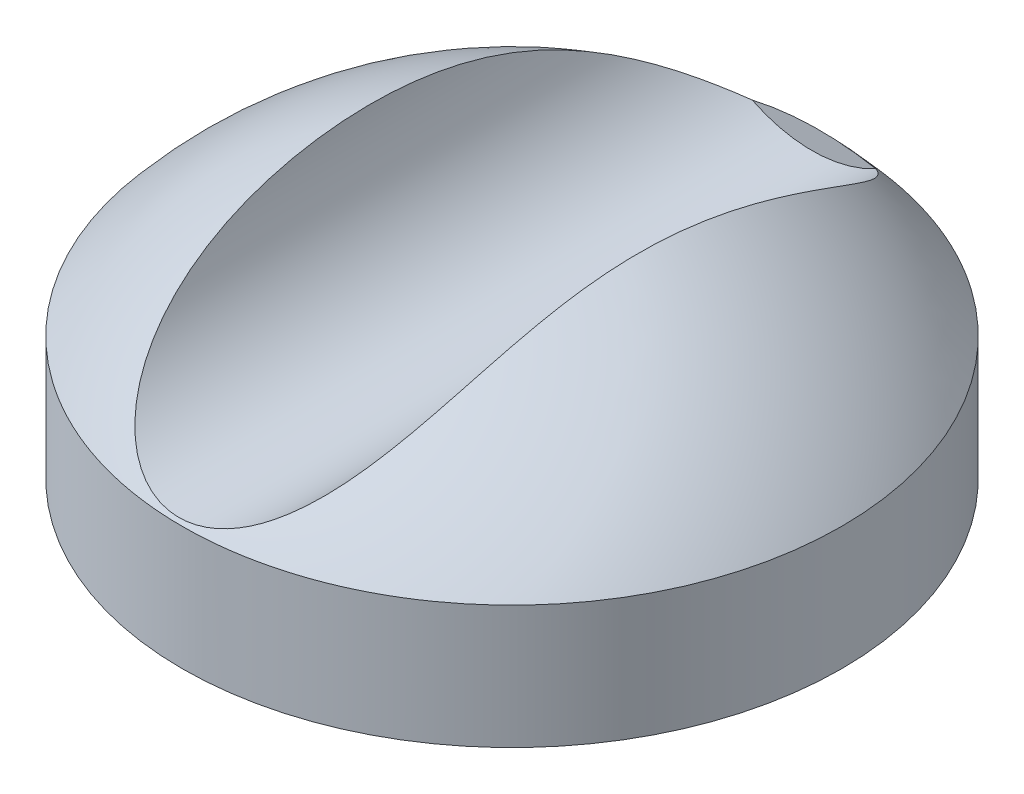
ISO-10303-21;
HEADER;
FILE_DESCRIPTION(('STEP AP214'),'2;1');
FILE_NAME('part.step','',(''),(''),'','','');
FILE_SCHEMA(('AUTOMOTIVE_DESIGN { 1 0 10303 214 1 1 1 1 }'));
ENDSEC;
DATA;
#1=APPLICATION_CONTEXT('core data for automotive mechanical design processes');
#2=APPLICATION_PROTOCOL_DEFINITION('international standard','automotive_design',2000,#1);
#3=PRODUCT_CONTEXT('',#1,'mechanical');
#4=PRODUCT('Part','Part','',(#3));
#5=PRODUCT_RELATED_PRODUCT_CATEGORY('part','',(#4));
#6=PRODUCT_DEFINITION_FORMATION('','',#4);
#7=PRODUCT_DEFINITION_CONTEXT('part definition',#1,'design');
#8=PRODUCT_DEFINITION('design','',#6,#7);
#9=PRODUCT_DEFINITION_SHAPE('','',#8);
#10=(LENGTH_UNIT() NAMED_UNIT(*) SI_UNIT(.MILLI.,.METRE.));
#11=(NAMED_UNIT(*) PLANE_ANGLE_UNIT() SI_UNIT($,.RADIAN.));
#12=(NAMED_UNIT(*) SI_UNIT($,.STERADIAN.) SOLID_ANGLE_UNIT());
#13=UNCERTAINTY_MEASURE_WITH_UNIT(LENGTH_MEASURE(1.E-05),#10,'distance_accuracy_value','');
#14=(GEOMETRIC_REPRESENTATION_CONTEXT(3) GLOBAL_UNCERTAINTY_ASSIGNED_CONTEXT((#13)) GLOBAL_UNIT_ASSIGNED_CONTEXT((#10,
#11,#12)) REPRESENTATION_CONTEXT('',''));
#15=CARTESIAN_POINT('',(0.,0.,0.));
#16=DIRECTION('',(0.,0.,1.));
#17=DIRECTION('',(1.,0.,0.));
#18=AXIS2_PLACEMENT_3D('',#15,#16,#17);
#19=CARTESIAN_POINT('',(0.,0.,0.));
#20=DIRECTION('',(0.,1.,0.));
#21=DIRECTION('',(0.,0.,1.));
#22=AXIS2_PLACEMENT_3D('',#19,#20,#21);
#23=PLANE('',#22);
#24=CARTESIAN_POINT('',(0.,0.,0.));
#25=DIRECTION('',(0.,1.,0.));
#26=DIRECTION('',(0.,0.,1.));
#27=AXIS2_PLACEMENT_3D('',#24,#25,#26);
#28=CIRCLE('',#27,106.926704947116);
#29=CARTESIAN_POINT('',(0.,0.,106.926704947116));
#30=VERTEX_POINT('',#29);
#31=EDGE_CURVE('E98',#30,#30,#28,.T.);
#32=ORIENTED_EDGE('',*,*,#31,.F.);
#33=EDGE_LOOP('',(#32));
#34=FACE_BOUND('',#33,.T.);
#35=DIRECTION('',(0.,0.,1.));
#36=VECTOR('',#35,1.);
#37=CARTESIAN_POINT('',(5.9134746822771,0.,-99.6701832640383));
#38=LINE('',#37,#36);
#39=CARTESIAN_POINT('',(5.9134746822771,0.,-99.6701832640383));
#40=VERTEX_POINT('',#39);
#41=CARTESIAN_POINT('',(5.9134746822771,0.,-89.549093251037));
#42=VERTEX_POINT('',#41);
#43=EDGE_CURVE('E89',#40,#42,#38,.T.);
#44=ORIENTED_EDGE('',*,*,#43,.F.);
#45=DIRECTION('',(1.,0.,0.));
#46=VECTOR('',#45,1.);
#47=CARTESIAN_POINT('',(5.9134746822771,0.,-99.6701832640383));
#48=LINE('',#47,#46);
#49=CARTESIAN_POINT('',(0.340261962225696,0.,-99.6701832640383));
#50=VERTEX_POINT('',#49);
#51=EDGE_CURVE('E115',#50,#40,#48,.T.);
#52=ORIENTED_EDGE('',*,*,#51,.F.);
#53=DIRECTION('',(0.,0.,-1.));
#54=VECTOR('',#53,1.);
#55=CARTESIAN_POINT('',(0.340261962225696,0.,-99.6701832640383));
#56=LINE('',#55,#54);
#57=CARTESIAN_POINT('',(0.340261962225696,0.,-89.549093251037));
#58=VERTEX_POINT('',#57);
#59=EDGE_CURVE('E119',#58,#50,#56,.T.);
#60=ORIENTED_EDGE('',*,*,#59,.F.);
#61=DIRECTION('',(-1.,0.,0.));
#62=VECTOR('',#61,1.);
#63=CARTESIAN_POINT('',(5.9134746822771,0.,-89.549093251037));
#64=LINE('',#63,#62);
#65=EDGE_CURVE('E60',#42,#58,#64,.T.);
#66=ORIENTED_EDGE('',*,*,#65,.F.);
#67=EDGE_LOOP('',(#44,#52,#60,#66));
#68=FACE_BOUND('',#67,.T.);
#69=ADVANCED_FACE('F33',(#34,#68),#23,.F.);
#70=CARTESIAN_POINT('',(0.,40.,0.));
#71=DIRECTION('',(0.,-1.,0.));
#72=DIRECTION('',(0.,0.,-1.));
#73=AXIS2_PLACEMENT_3D('',#70,#71,#72);
#74=CYLINDRICAL_SURFACE('',#73,106.926704947116);
#75=CARTESIAN_POINT('',(0.,40.,0.));
#76=DIRECTION('',(0.,1.,0.));
#77=DIRECTION('',(0.,0.,1.));
#78=AXIS2_PLACEMENT_3D('',#75,#76,#77);
#79=CIRCLE('',#78,106.926704947116);
#80=CARTESIAN_POINT('',(0.,40.,106.926704947116));
#81=VERTEX_POINT('',#80);
#82=EDGE_CURVE('E86',#81,#81,#79,.T.);
#83=ORIENTED_EDGE('',*,*,#82,.F.);
#84=EDGE_LOOP('',(#83));
#85=FACE_BOUND('',#84,.T.);
#86=ORIENTED_EDGE('',*,*,#31,.T.);
#87=EDGE_LOOP('',(#86));
#88=FACE_BOUND('',#87,.T.);
#89=ADVANCED_FACE('F94',(#85,#88),#74,.T.);
#90=CARTESIAN_POINT('',(0.,-49.333202308476,0.));
#91=DIRECTION('',(0.,0.,1.));
#92=DIRECTION('',(1.,0.,0.));
#93=AXIS2_PLACEMENT_3D('',#90,#91,#92);
#94=SPHERICAL_SURFACE('',#93,139.333202308476);
#95=CARTESIAN_POINT('',(-21.7592276534216,45.5672296055095,-99.6703832640383));
#96=CARTESIAN_POINT('',(-22.3248867105338,45.847779302223,-99.2797763568685));
#97=CARTESIAN_POINT('',(-22.8768416566299,46.1368609895804,-98.8757295315252));
#98=CARTESIAN_POINT('',(-23.9533347217881,46.7296686619277,-98.0431236376467));
#99=CARTESIAN_POINT('',(-24.4778840656232,47.0333885518493,-97.6145747576876));
#100=CARTESIAN_POINT('',(-25.4986966818507,47.6524833920622,-96.736148397411));
#101=CARTESIAN_POINT('',(-25.9950298799074,47.9678260234149,-96.2863292019352));
#102=CARTESIAN_POINT('',(-26.9613869235278,48.6088743392295,-95.3662547604207));
#103=CARTESIAN_POINT('',(-27.4314078441912,48.9345811695,-94.895997252718));
#104=CARTESIAN_POINT('',(-28.7904912584752,49.9154391362442,-93.4702481921423));
#105=CARTESIAN_POINT('',(-29.6425043463494,50.5829097301229,-92.4876520294239));
#106=CARTESIAN_POINT('',(-31.2528086342148,51.9385951713216,-90.4608406850741));
#107=CARTESIAN_POINT('',(-32.0110201407843,52.6268270482832,-89.4165742062366));
#108=CARTESIAN_POINT('',(-33.2448510301319,53.824156096962,-87.5683185918342));
#109=CARTESIAN_POINT('',(-33.7411423557241,54.3309132831215,-86.77647887199));
#110=CARTESIAN_POINT('',(-34.6901018105293,55.3464917401481,-85.168241513939));
#111=CARTESIAN_POINT('',(-35.1427653931064,55.8553132203986,-84.3518413277877));
#112=CARTESIAN_POINT('',(-36.0071035202598,56.8721030729203,-82.6969949349944));
#113=CARTESIAN_POINT('',(-36.4187723664804,57.3800713169689,-81.858545683904));
#114=CARTESIAN_POINT('',(-37.2036451234931,58.3925386439738,-80.1618657831009));
#115=CARTESIAN_POINT('',(-37.5768500307821,58.8970378164881,-79.3036356465628));
#116=CARTESIAN_POINT('',(-38.2899051272274,59.9039925475345,-77.5629168955739));
#117=CARTESIAN_POINT('',(-38.6294936691241,60.4064067216664,-76.6802974542236));
#118=CARTESIAN_POINT('',(-39.274695793148,61.4034608058976,-74.8984469251442));
#119=CARTESIAN_POINT('',(-39.5803094798494,61.898100739922,-73.9992158885554));
#120=CARTESIAN_POINT('',(-40.1599346121522,62.8778117819138,-72.1855625461266));
#121=CARTESIAN_POINT('',(-40.4339474438133,63.3628833087913,-71.2711409085827));
#122=CARTESIAN_POINT('',(-40.9526724886813,64.3219122382482,-69.4282455237801));
#123=CARTESIAN_POINT('',(-41.1973831080992,64.7958690351551,-68.4997710152567));
#124=CARTESIAN_POINT('',(-41.8059963521166,66.0272474127774,-66.038040033241));
#125=CARTESIAN_POINT('',(-42.1473158944507,66.7742281872809,-64.4939225353009));
#126=CARTESIAN_POINT('',(-42.7666253808273,68.2292813874873,-61.3748934641911));
#127=CARTESIAN_POINT('',(-43.0446072992375,68.9373488737965,-59.7999780159768));
#128=CARTESIAN_POINT('',(-43.5456537836782,70.3101825868445,-56.6218874923164));
#129=CARTESIAN_POINT('',(-43.7686913253823,70.974927387631,-55.0186989245167));
#130=CARTESIAN_POINT('',(-44.1674177432848,72.2566066472164,-51.7876354383461));
#131=CARTESIAN_POINT('',(-44.3431083196269,72.8735428221695,-50.159761408603));
#132=CARTESIAN_POINT('',(-44.6542250043469,74.0555112250335,-46.8830662967814));
#133=CARTESIAN_POINT('',(-44.7896848214135,74.6205866303162,-45.2342639650776));
#134=CARTESIAN_POINT('',(-45.0271873306162,75.6961873271578,-41.916589880219));
#135=CARTESIAN_POINT('',(-45.1292298327239,76.2067123085035,-40.2477180129942));
#136=CARTESIAN_POINT('',(-45.3059873182079,77.1702221615507,-36.8923609536907));
#137=CARTESIAN_POINT('',(-45.3807074420091,77.6232178463204,-35.2058791362186));
#138=CARTESIAN_POINT('',(-45.5083817815076,78.4691991430936,-31.8171119639762));
#139=CARTESIAN_POINT('',(-45.5613359042002,78.8621844986731,-30.1148265417101));
#140=CARTESIAN_POINT('',(-45.6526087165689,79.6037724444045,-26.6120407898396));
#141=CARTESIAN_POINT('',(-45.6900736090588,79.9492168830182,-24.8108484061118));
#142=CARTESIAN_POINT('',(-45.7513538540092,80.569244376954,-21.1960609237392));
#143=CARTESIAN_POINT('',(-45.7751691143894,80.8438269542353,-19.3824657415086));
#144=CARTESIAN_POINT('',(-45.8131409161586,81.3203025135617,-15.7455717350479));
#145=CARTESIAN_POINT('',(-45.8272971032941,81.5221928294367,-13.9222725573878));
#146=CARTESIAN_POINT('',(-45.8489497366344,81.8518875764893,-10.268945612543));
#147=CARTESIAN_POINT('',(-45.8564462016037,81.9796922164108,-8.43891786433122));
#148=CARTESIAN_POINT('',(-45.8667100455313,82.1603248074319,-4.77518121827063));
#149=CARTESIAN_POINT('',(-45.8694775127132,82.2131541572573,-2.94147238973451));
#150=CARTESIAN_POINT('',(-45.8710891874155,82.2434688843173,0.726568419377679));
#151=CARTESIAN_POINT('',(-45.8699333989557,82.2209543387494,2.56090039931335));
#152=CARTESIAN_POINT('',(-45.8633550466936,82.1007414265905,6.22704079316603));
#153=CARTESIAN_POINT('',(-45.8579325946801,82.0030450298068,8.05884927194052));
#154=CARTESIAN_POINT('',(-45.841337241459,81.7331551292062,11.716943519564));
#155=CARTESIAN_POINT('',(-45.8301643037076,81.5609611519653,13.5432292532423));
#156=CARTESIAN_POINT('',(-45.7989012317008,81.1351819105995,17.2577952108827));
#157=CARTESIAN_POINT('',(-45.7784829639582,80.8787066276683,19.1457416613619));
#158=CARTESIAN_POINT('',(-45.7246121630316,80.2885251054501,22.9093420446783));
#159=CARTESIAN_POINT('',(-45.6911594835359,79.9548179992497,24.7849958392896));
#160=CARTESIAN_POINT('',(-45.6060607573586,79.2124509484647,28.5214710741605));
#161=CARTESIAN_POINT('',(-45.5544102083488,78.8037724672445,30.3822887271997));
#162=CARTESIAN_POINT('',(-45.4267850327676,77.9143523671192,34.0857598831269));
#163=CARTESIAN_POINT('',(-45.3508106257512,77.4336113986946,35.9284135498141));
#164=CARTESIAN_POINT('',(-45.1675626975199,76.403575369152,39.5919511978716));
#165=CARTESIAN_POINT('',(-45.0603039914242,75.8543128276864,41.4128450599882));
#166=CARTESIAN_POINT('',(-44.8066504744999,74.6907296164027,45.0310686120256));
#167=CARTESIAN_POINT('',(-44.6602542732776,74.0764066357243,46.8283974623988));
#168=CARTESIAN_POINT('',(-44.319831022109,72.7872251309966,50.3956258917835));
#169=CARTESIAN_POINT('',(-44.1258280866576,72.1123973642488,52.1655388768549));
#170=CARTESIAN_POINT('',(-43.6808451228173,70.7066901207773,55.6755956987861));
#171=CARTESIAN_POINT('',(-43.4298721178242,69.9758175607278,57.41574317679));
#172=CARTESIAN_POINT('',(-42.9841923573196,68.791268539261,60.1154964374895));
#173=CARTESIAN_POINT('',(-42.8122538544538,68.3547665212088,61.0864714961809));
#174=CARTESIAN_POINT('',(-42.4448831052148,67.4666160589806,63.0169664698239));
#175=CARTESIAN_POINT('',(-42.249451863951,67.0149682633948,63.97648687292));
#176=CARTESIAN_POINT('',(-41.8330514995305,66.0977128822432,65.8832570561751));
#177=CARTESIAN_POINT('',(-41.6120821385841,65.6321051667241,66.8305067219879));
#178=CARTESIAN_POINT('',(-41.1424661149593,64.6882507959801,68.7117866211894));
#179=CARTESIAN_POINT('',(-40.8938192466603,64.2100040468778,69.6458167563101));
#180=CARTESIAN_POINT('',(-40.3668789284324,63.2428270811692,71.4986313156483));
#181=CARTESIAN_POINT('',(-40.0886155557053,62.7539080965594,72.4174301322671));
#182=CARTESIAN_POINT('',(-39.4999025335607,61.7665461343575,74.2395127245832));
#183=CARTESIAN_POINT('',(-39.1894524085177,61.2681030161155,75.1427962707805));
#184=CARTESIAN_POINT('',(-38.534003817127,60.2636349572684,76.9322096123066));
#185=CARTESIAN_POINT('',(-38.1890131438341,59.7576117486984,77.8183432234133));
#186=CARTESIAN_POINT('',(-37.4619276630001,58.7399981170667,79.5719075258629));
#187=CARTESIAN_POINT('',(-37.0798351906511,58.2284080461814,80.4393393901022));
#188=CARTESIAN_POINT('',(-36.0965545588628,56.9729682926013,82.5360687475353));
#189=CARTESIAN_POINT('',(-35.4736518236541,56.2272902135879,83.7542196973116));
#190=CARTESIAN_POINT('',(-34.1364149401629,54.7373434337898,86.1405461538576));
#191=CARTESIAN_POINT('',(-33.4220759578288,53.9930748096327,87.3087190140259));
#192=CARTESIAN_POINT('',(-31.8945061721545,52.517103854529,89.5846919357247));
#193=CARTESIAN_POINT('',(-31.0813946499453,51.7853875605485,90.6925625233987));
#194=CARTESIAN_POINT('',(-29.3476820049209,50.3463643848224,92.8377948553046));
#195=CARTESIAN_POINT('',(-28.427126312425,49.6390473491282,93.8751861086762));
#196=CARTESIAN_POINT('',(-26.7808391510077,48.4816738506315,95.5505609168858));
#197=CARTESIAN_POINT('',(-26.0855047986802,48.0209718095835,96.211142026038));
#198=CARTESIAN_POINT('',(-24.6396316985206,47.1240435372373,97.4872293692161));
#199=CARTESIAN_POINT('',(-23.8890958087228,46.6878160408393,98.1027379335641));
#200=CARTESIAN_POINT('',(-22.3328303517116,45.84690981924,99.2817252578381));
#201=CARTESIAN_POINT('',(-21.5271573372691,45.4421996523145,99.8452559771823));
#202=CARTESIAN_POINT('',(-19.860409510774,44.6712499246677,100.913806142839));
#203=CARTESIAN_POINT('',(-18.9993459245229,44.3050026081854,101.41883738728));
#204=CARTESIAN_POINT('',(-17.3962009937373,43.6854791346902,102.271069808082));
#205=CARTESIAN_POINT('',(-16.663426799535,43.4240683175648,102.629885722528));
#206=CARTESIAN_POINT('',(-15.1654100709742,42.9357156154282,103.300198908976));
#207=CARTESIAN_POINT('',(-14.4001708954759,42.7087701756662,103.61170106091));
#208=CARTESIAN_POINT('',(-12.8406889716744,42.2936922356566,104.183024330508));
#209=CARTESIAN_POINT('',(-12.046457603662,42.1055446948775,104.442865473857));
#210=CARTESIAN_POINT('',(-10.4330704194535,41.7719492122408,104.906987627892));
#211=CARTESIAN_POINT('',(-9.61391437040042,41.6265016694402,105.111268119329));
#212=CARTESIAN_POINT('',(-7.9506156751754,41.3809361378366,105.461919533816));
#213=CARTESIAN_POINT('',(-7.10634123263326,41.2811323143947,105.607888253544));
#214=CARTESIAN_POINT('',(-5.40491616887063,41.130984363971,105.837146273279));
#215=CARTESIAN_POINT('',(-4.54776548531513,41.0806404765075,105.920435269748));
#216=CARTESIAN_POINT('',(-2.82841673444578,41.0309630277352,106.022643828846));
#217=CARTESIAN_POINT('',(-1.96622035051135,41.0316133265213,106.041583756284));
#218=CARTESIAN_POINT('',(-0.24444643828817,41.0841379346589,106.014753406653));
#219=CARTESIAN_POINT('',(0.615131298690509,41.1360080489885,105.968988428934));
#220=CARTESIAN_POINT('',(2.23162731130342,41.2815540108234,105.822103537876));
#221=CARTESIAN_POINT('',(2.98961360245974,41.370114241292,105.727490326325));
#222=CARTESIAN_POINT('',(4.49220201528689,41.5855095243756,105.489048570207));
#223=CARTESIAN_POINT('',(5.23680531486359,41.7123411908722,105.345224379497));
#224=CARTESIAN_POINT('',(6.70817135919111,42.0020615389213,105.010483187352));
#225=CARTESIAN_POINT('',(7.43493328878465,42.1649518645704,104.819564038572));
#226=CARTESIAN_POINT('',(8.86682512025489,42.524083407292,104.393247228167));
#227=CARTESIAN_POINT('',(9.571953738246,42.7203265992754,104.157846932603));
#228=CARTESIAN_POINT('',(10.9894790464588,43.1528948812852,103.63368368711));
#229=CARTESIAN_POINT('',(11.7007121945426,43.3906507093327,103.342960964339));
#230=CARTESIAN_POINT('',(13.0935916780551,43.8957213235731,102.719583943362));
#231=CARTESIAN_POINT('',(13.7752380105586,44.1630361126884,102.38692964101));
#232=CARTESIAN_POINT('',(15.1074164541007,44.7236539309647,101.68314170096));
#233=CARTESIAN_POINT('',(15.7579406024226,45.0169635568164,101.311998291822));
#234=CARTESIAN_POINT('',(17.0268745351298,45.6260572261337,100.534632627178));
#235=CARTESIAN_POINT('',(17.6452769373672,45.9418463966168,100.12840236471));
#236=CARTESIAN_POINT('',(18.7277665353593,46.5267540416572,99.3694747349604));
#237=CARTESIAN_POINT('',(19.1977926480887,46.7924149902463,99.0225389209103));
#238=CARTESIAN_POINT('',(20.1170117070849,47.3342442992372,98.3100375336591));
#239=CARTESIAN_POINT('',(20.5662078426948,47.6104110391984,97.9444748305889));
#240=CARTESIAN_POINT('',(21.883343721425,48.4527675350177,96.8215419111602));
#241=CARTESIAN_POINT('',(22.7205587811937,49.0326647206193,96.0381194307644));
#242=CARTESIAN_POINT('',(24.3169647127295,50.2192226223027,94.4107875359519));
#243=CARTESIAN_POINT('',(25.0759880488196,50.8259369822929,93.5667545589426));
#244=CARTESIAN_POINT('',(26.5183159205439,52.0561318953556,91.8279748487327));
#245=CARTESIAN_POINT('',(27.2016222441174,52.6796120520976,90.9332293137844));
#246=CARTESIAN_POINT('',(28.3514683896506,53.794519988047,89.3062301668731));
#247=CARTESIAN_POINT('',(28.832206063008,54.2841249802762,88.5826652886772));
#248=CARTESIAN_POINT('',(29.7533481493346,55.2659827683007,87.1119045707581));
#249=CARTESIAN_POINT('',(30.1937478267863,55.7582358678097,86.3647059703485));
#250=CARTESIAN_POINT('',(31.0366149850927,56.7429214011718,84.8488114298388));
#251=CARTESIAN_POINT('',(31.439065179668,57.2353538151608,84.0801058979209));
#252=CARTESIAN_POINT('',(32.2080758778555,58.2178834688528,82.5235718812613));
#253=CARTESIAN_POINT('',(32.5746374434172,58.7079807772435,81.7357439632152));
#254=CARTESIAN_POINT('',(33.2746056912068,59.6845546808231,80.1415514687408));
#255=CARTESIAN_POINT('',(33.6079638151032,60.1710250377988,79.3351618069197));
#256=CARTESIAN_POINT('',(34.243080164812,61.1378560961795,77.7064713728622));
#257=CARTESIAN_POINT('',(34.5448385006483,61.6182168188519,76.8841706560365));
#258=CARTESIAN_POINT('',(35.1187977131725,62.5711993613664,75.2250860923442));
#259=CARTESIAN_POINT('',(35.3910026835461,63.0438222453202,74.3883042700427));
#260=CARTESIAN_POINT('',(35.9079050950179,63.9800203194613,72.7012709512777));
#261=CARTESIAN_POINT('',(36.1526010148452,64.4435950081063,71.8510187128539));
#262=CARTESIAN_POINT('',(36.7693303504056,65.6627429973435,69.5732458469222));
#263=CARTESIAN_POINT('',(37.1189354604109,66.409295963219,68.13476793608));
#264=CARTESIAN_POINT('',(37.7559555899019,67.8690465150733,65.2273726935054));
#265=CARTESIAN_POINT('',(38.0433622967598,68.5822396326379,63.7584513218075));
#266=CARTESIAN_POINT('',(38.5637835487175,69.9713628781337,60.7926566081447));
#267=CARTESIAN_POINT('',(38.7967684364163,70.647272535752,59.2957685031991));
#268=CARTESIAN_POINT('',(39.2153192624295,71.9577074159585,56.2775771407774));
#269=CARTESIAN_POINT('',(39.4008869786018,72.5922341894904,54.7562748009615));
#270=CARTESIAN_POINT('',(39.7315300496259,73.8175107103419,51.689516943484));
#271=CARTESIAN_POINT('',(39.8765524512305,74.4082024756562,50.1440325979052));
#272=CARTESIAN_POINT('',(40.1320490043037,75.5420270377605,47.0329090547905));
#273=CARTESIAN_POINT('',(40.2425229303869,76.0851595242695,45.467269725838));
#274=CARTESIAN_POINT('',(40.4347189325565,77.1211844653642,42.3180719719757));
#275=CARTESIAN_POINT('',(40.5164467491646,77.6140869367705,40.7345171900034));
#276=CARTESIAN_POINT('',(40.6565433209165,78.5474634756479,37.5510120014325));
#277=CARTESIAN_POINT('',(40.7149119597738,78.9879372821114,35.9510615132536));
#278=CARTESIAN_POINT('',(40.8162195887564,79.8398722941647,32.6374199404581));
#279=CARTESIAN_POINT('',(40.8579846773273,80.2478677316047,30.9228007476413));
#280=CARTESIAN_POINT('',(40.9259483537992,81.0002205414582,27.4793374483694));
#281=CARTESIAN_POINT('',(40.9521468112751,81.3445773806582,25.7504932228526));
#282=CARTESIAN_POINT('',(40.9935195089629,81.9677690998146,22.2808174703673));
#283=CARTESIAN_POINT('',(41.0086932682449,82.2466011210254,20.5399854237982));
#284=CARTESIAN_POINT('',(41.0317898130466,82.7371496547361,17.0488395029695));
#285=CARTESIAN_POINT('',(41.0397126197084,82.9488663629284,15.2985256563717));
#286=CARTESIAN_POINT('',(41.0512337176218,83.3037846265375,11.7927196332408));
#287=CARTESIAN_POINT('',(41.0548363456817,83.4470548048637,10.0372344261107));
#288=CARTESIAN_POINT('',(41.0597472142633,83.6645537925609,6.52199021789846));
#289=CARTESIAN_POINT('',(41.0610554629188,83.7387828466903,4.76223123198961));
#290=CARTESIAN_POINT('',(41.0624348347029,83.817757626578,1.24117704717665));
#291=CARTESIAN_POINT('',(41.0625059770046,83.8225044291976,-0.520118127495962));
#292=CARTESIAN_POINT('',(41.0614764757653,83.7624907233383,-4.04153607721869));
#293=CARTESIAN_POINT('',(41.0603758167576,83.6977292974156,-5.80165883648719));
#294=CARTESIAN_POINT('',(41.0559004574066,83.4903156440347,-9.47309100486638));
#295=CARTESIAN_POINT('',(41.0523337560248,83.3412974699874,-11.3840432041746));
#296=CARTESIAN_POINT('',(41.0402556011226,82.9624307310082,-15.1979158917473));
#297=CARTESIAN_POINT('',(41.0317440556362,82.7325806627681,-17.1008362299695));
#298=CARTESIAN_POINT('',(41.0060075642597,82.1935609257815,-20.8957683073112));
#299=CARTESIAN_POINT('',(40.9887807003822,81.884373804648,-22.7877775524803));
#300=CARTESIAN_POINT('',(40.940674318522,81.1887649441862,-26.5573427857155));
#301=CARTESIAN_POINT('',(40.909794910356,80.802343826117,-28.4348988899144));
#302=CARTESIAN_POINT('',(40.8283572130176,79.9544997480183,-32.1738286095883));
#303=CARTESIAN_POINT('',(40.7777863350725,79.4930289187706,-34.0351910926584));
#304=CARTESIAN_POINT('',(40.6499967052977,78.4981760016071,-37.7377333141037));
#305=CARTESIAN_POINT('',(40.572777280883,77.9647920988781,-39.5789125418617));
#306=CARTESIAN_POINT('',(40.3838848270561,76.8296742427158,-43.2375762499059));
#307=CARTESIAN_POINT('',(40.2722240397727,76.2279646234937,-45.05506891068));
#308=CARTESIAN_POINT('',(40.0058033620153,74.9598430580547,-48.6640645438876));
#309=CARTESIAN_POINT('',(39.8510470389587,74.2934364703792,-50.4555696546428));
#310=CARTESIAN_POINT('',(39.55094542399,73.1386356323441,-53.4013440019528));
#311=CARTESIAN_POINT('',(39.4205019823375,72.667362935581,-54.5638873217765));
#312=CARTESIAN_POINT('',(39.1339912916128,71.700052481019,-56.8754188880528));
#313=CARTESIAN_POINT('',(38.9779250216194,71.2040156699903,-58.0244076506437));
#314=CARTESIAN_POINT('',(38.6371257510897,70.1886302621472,-60.3078415682371));
#315=CARTESIAN_POINT('',(38.4523909704892,69.6692802192088,-61.4422858154137));
#316=CARTESIAN_POINT('',(38.0510585922603,68.608948210695,-63.6953509587948));
#317=CARTESIAN_POINT('',(37.8344608743456,68.0679661634618,-64.8139717952466));
#318=CARTESIAN_POINT('',(37.3662370782813,66.9667164224489,-67.0329922619711));
#319=CARTESIAN_POINT('',(37.1146427581007,66.4064665565522,-68.1334074113273));
#320=CARTESIAN_POINT('',(36.572716194964,65.2682825261412,-70.3154680083866));
#321=CARTESIAN_POINT('',(36.2823829738414,64.6903479153668,-71.3971129813586));
#322=CARTESIAN_POINT('',(35.6593416771601,63.5193770210663,-73.5393391469306));
#323=CARTESIAN_POINT('',(35.3266492887823,62.9263463928798,-74.5999279701777));
#324=CARTESIAN_POINT('',(34.6148951117561,61.7277641585281,-76.6980988971616));
#325=CARTESIAN_POINT('',(34.2358379101427,61.1222137959022,-77.7356832648323));
#326=CARTESIAN_POINT('',(33.3157900611696,59.7335301490717,-80.0676404763572));
#327=CARTESIAN_POINT('',(32.7589498375738,58.9474094049432,-81.3540556549578));
#328=CARTESIAN_POINT('',(31.5538968843826,57.3674230179058,-83.8787816672296));
#329=CARTESIAN_POINT('',(30.9056808517004,56.5735570959873,-85.1170907598791));
#330=CARTESIAN_POINT('',(29.5113057706228,54.9909613034491,-87.5320095563402));
#331=CARTESIAN_POINT('',(28.7655640291486,54.2022237860728,-88.7088538263198));
#332=CARTESIAN_POINT('',(27.1647098757161,52.6384659832815,-90.9953578156613));
#333=CARTESIAN_POINT('',(26.3096438068669,51.8634400430261,-92.1050457109521));
#334=CARTESIAN_POINT('',(24.8834386764119,50.6764507312779,-93.7732834505536));
#335=CARTESIAN_POINT('',(24.3527459661766,50.2546714899912,-94.3596496379172));
#336=CARTESIAN_POINT('',(23.2530147371666,49.4232066949426,-95.5039911415918));
#337=CARTESIAN_POINT('',(22.6839897679404,49.0135169407073,-96.0619763687697));
#338=CARTESIAN_POINT('',(21.5031455879022,48.2073542085634,-97.1494035877067));
#339=CARTESIAN_POINT('',(20.8911125767905,47.8109642130952,-97.6786758311087));
#340=CARTESIAN_POINT('',(19.6258033346276,47.0373880313085,-98.7020346938479));
#341=CARTESIAN_POINT('',(18.9724919198122,46.6602187362028,-99.1960905118648));
#342=CARTESIAN_POINT('',(18.298474393715,46.2948364688459,-99.6703832640383));
#343=B_SPLINE_CURVE_WITH_KNOTS('',3,(#95,#96,#97,#98,#99,#100,#101,#102,#103,#104,#105,#106,
#107,#108,#109,#110,#111,#112,#113,#114,#115,#116,#117,#118,#119,#120,#121,#122,#123,#124,#125,
#126,#127,#128,#129,#130,#131,#132,#133,#134,#135,#136,#137,#138,#139,#140,#141,#142,#143,#144,
#145,#146,#147,#148,#149,#150,#151,#152,#153,#154,#155,#156,#157,#158,#159,#160,#161,#162,#163,
#164,#165,#166,#167,#168,#169,#170,#171,#172,#173,#174,#175,#176,#177,#178,#179,#180,#181,#182,
#183,#184,#185,#186,#187,#188,#189,#190,#191,#192,#193,#194,#195,#196,#197,#198,#199,#200,#201,
#202,#203,#204,#205,#206,#207,#208,#209,#210,#211,#212,#213,#214,#215,#216,#217,#218,#219,#220,
#221,#222,#223,#224,#225,#226,#227,#228,#229,#230,#231,#232,#233,#234,#235,#236,#237,#238,#239,
#240,#241,#242,#243,#244,#245,#246,#247,#248,#249,#250,#251,#252,#253,#254,#255,#256,#257,#258,
#259,#260,#261,#262,#263,#264,#265,#266,#267,#268,#269,#270,#271,#272,#273,#274,#275,#276,#277,
#278,#279,#280,#281,#282,#283,#284,#285,#286,#287,#288,#289,#290,#291,#292,#293,#294,#295,#296,
#297,#298,#299,#300,#301,#302,#303,#304,#305,#306,#307,#308,#309,#310,#311,#312,#313,#314,#315,
#316,#317,#318,#319,#320,#321,#322,#323,#324,#325,#326,#327,#328,#329,#330,#331,#332,#333,#334,
#335,#336,#337,#338,#339,#340,#341,#342),.UNSPECIFIED.,.F.,.F.,(4,2,2,2,2,2,2,2,2,2,2,2,2,2,2,2,
2,2,2,2,2,2,2,2,2,2,2,2,2,2,2,2,2,2,2,2,2,2,2,2,2,2,2,2,2,2,2,2,2,2,2,2,2,2,2,2,2,2,2,2,2,2,2,2,
2,2,2,2,2,2,2,2,2,2,2,2,2,2,2,2,2,2,2,2,2,2,2,2,2,2,2,2,2,2,2,2,2,2,2,2,2,2,2,2,2,2,2,2,2,2,2,2,
2,2,2,2,2,2,2,2,2,2,2,4),(0.,2.22687884969839,4.45283834781835,6.67301663620453,
8.89344123386263,13.2734175831173,17.6570899525289,20.8451236447672,24.0334892173688,
27.2222973627629,30.4110228739732,33.6228838331557,36.8347349059948,40.0464450487377,
43.2583298016801,48.5029797868141,53.7482939625378,58.996182911817,64.2438833937907,
69.4871744284117,74.7304952786065,79.9728291436346,85.2151854085287,90.7169308104724,
96.2187133267268,101.720697614038,107.222666398877,112.724532538608,118.226393041128,
123.728109396686,129.22986071557,134.944373750135,140.658950932205,146.374942949681,
152.090883374206,157.804121317623,163.51756225576,169.228115086305,174.937964289291,
178.172726236859,181.40734983814,184.64200355997,187.876681314156,191.108104864366,
194.339576172315,197.570320030172,200.800860676223,205.472163915136,210.143714218596,
214.80967805786,219.473676099454,222.663386093533,225.852931057938,229.039252245886,
232.224929696107,234.792841769349,237.360488808623,239.927138585652,242.493812348782,
245.077896027568,247.661992220165,250.245270537193,252.82833729527,255.132648003845,
257.436754895075,259.740966863831,262.045315318591,264.455896387106,266.86647769394,
269.277672493481,271.689418998714,273.614006266098,275.538297874282,279.387972364567,
283.245730829646,287.103398180342,290.093847163671,293.084646764847,296.076802182943,
299.068869035965,302.065249292751,305.06161911642,308.057573356671,311.053693193986,
316.025436339206,320.997843533022,325.972954172143,330.947878247253,335.929269671185,
340.910693591734,345.891122169595,350.871575540687,356.159254496804,361.446977755189,
366.734931665887,372.022870158018,377.305495901295,382.588102917011,387.87062806087,
393.153222929982,398.901724591014,404.6503331681,410.400207396927,416.150035376454,
421.903545276843,427.657200401186,433.40881274995,439.159949125833,442.943034137399,
446.72597462639,450.509150096987,454.292339849881,458.072118643557,461.851992895625,
465.630471368737,469.408576325492,474.22694876341,479.045495422337,483.844060059402,
488.640597264468,491.328364309928,494.015186228444,496.716465986645,499.42008008765),.UNSPECIFIED.);
#344=CARTESIAN_POINT('',(-21.7595172820952,45.5673732498309,-99.6701832640383));
#345=VERTEX_POINT('',#344);
#346=CARTESIAN_POINT('',(18.2987586147565,46.2949905365558,-99.6701832640383));
#347=VERTEX_POINT('',#346);
#348=EDGE_CURVE('E11',#345,#347,#343,.T.);
#349=ORIENTED_EDGE('',*,*,#348,.F.);
#350=CARTESIAN_POINT('',(0.,-49.333202308476,-99.6701832640383));
#351=DIRECTION('',(0.,0.,-1.));
#352=DIRECTION('',(-1.,0.,0.));
#353=AXIS2_PLACEMENT_3D('',#350,#351,#352);
#354=CIRCLE('',#353,97.3632160194379);
#355=EDGE_CURVE('E47',#347,#345,#354,.F.);
#356=ORIENTED_EDGE('',*,*,#355,.F.);
#357=EDGE_LOOP('',(#349,#356));
#358=FACE_BOUND('',#357,.T.);
#359=ORIENTED_EDGE('',*,*,#82,.T.);
#360=EDGE_LOOP('',(#359));
#361=FACE_BOUND('',#360,.T.);
#362=ADVANCED_FACE('F35',(#358,#361),#94,.T.);
#363=CARTESIAN_POINT('',(5.9134746822771,-0.1,-99.6701832640383));
#364=DIRECTION('',(-1.,0.,0.));
#365=DIRECTION('',(0.,0.,1.));
#366=AXIS2_PLACEMENT_3D('',#363,#364,#365);
#367=PLANE('',#366);
#368=ORIENTED_EDGE('',*,*,#43,.T.);
#369=DIRECTION('',(0.,1.,0.));
#370=VECTOR('',#369,1.);
#371=CARTESIAN_POINT('',(5.9134746822771,-0.1,-89.549093251037));
#372=LINE('',#371,#370);
#373=CARTESIAN_POINT('',(5.9134746822771,-0.1,-89.549093251037));
#374=VERTEX_POINT('',#373);
#375=EDGE_CURVE('E101',#374,#42,#372,.T.);
#376=ORIENTED_EDGE('',*,*,#375,.F.);
#377=DIRECTION('',(0.,0.,1.));
#378=VECTOR('',#377,1.);
#379=CARTESIAN_POINT('',(5.9134746822771,-0.1,-99.6701832640383));
#380=LINE('',#379,#378);
#381=CARTESIAN_POINT('',(5.9134746822771,-0.1,-99.6701832640383));
#382=VERTEX_POINT('',#381);
#383=EDGE_CURVE('E118',#382,#374,#380,.T.);
#384=ORIENTED_EDGE('',*,*,#383,.F.);
#385=DIRECTION('',(0.,1.,0.));
#386=VECTOR('',#385,1.);
#387=CARTESIAN_POINT('',(5.9134746822771,-0.1,-99.6701832640383));
#388=LINE('',#387,#386);
#389=EDGE_CURVE('E111',#382,#40,#388,.T.);
#390=ORIENTED_EDGE('',*,*,#389,.T.);
#391=EDGE_LOOP('',(#368,#376,#384,#390));
#392=FACE_BOUND('',#391,.T.);
#393=ADVANCED_FACE('F93',(#392),#367,.F.);
#394=CARTESIAN_POINT('',(5.9134746822771,-0.1,-89.549093251037));
#395=DIRECTION('',(0.,0.,-1.));
#396=DIRECTION('',(-1.,0.,0.));
#397=AXIS2_PLACEMENT_3D('',#394,#395,#396);
#398=PLANE('',#397);
#399=ORIENTED_EDGE('',*,*,#65,.T.);
#400=DIRECTION('',(0.,1.,0.));
#401=VECTOR('',#400,1.);
#402=CARTESIAN_POINT('',(0.340261962225696,-0.1,-89.549093251037));
#403=LINE('',#402,#401);
#404=CARTESIAN_POINT('',(0.340261962225696,-0.1,-89.549093251037));
#405=VERTEX_POINT('',#404);
#406=EDGE_CURVE('E105',#405,#58,#403,.T.);
#407=ORIENTED_EDGE('',*,*,#406,.F.);
#408=DIRECTION('',(-1.,0.,0.));
#409=VECTOR('',#408,1.);
#410=CARTESIAN_POINT('',(5.9134746822771,-0.1,-89.549093251037));
#411=LINE('',#410,#409);
#412=EDGE_CURVE('E128',#374,#405,#411,.T.);
#413=ORIENTED_EDGE('',*,*,#412,.F.);
#414=ORIENTED_EDGE('',*,*,#375,.T.);
#415=EDGE_LOOP('',(#399,#407,#413,#414));
#416=FACE_BOUND('',#415,.T.);
#417=ADVANCED_FACE('F140',(#416),#398,.F.);
#418=CARTESIAN_POINT('',(0.340261962225696,-0.1,-99.6701832640383));
#419=DIRECTION('',(1.,0.,0.));
#420=DIRECTION('',(0.,0.,-1.));
#421=AXIS2_PLACEMENT_3D('',#418,#419,#420);
#422=PLANE('',#421);
#423=ORIENTED_EDGE('',*,*,#59,.T.);
#424=DIRECTION('',(0.,1.,0.));
#425=VECTOR('',#424,1.);
#426=CARTESIAN_POINT('',(0.340261962225696,-0.1,-99.6701832640383));
#427=LINE('',#426,#425);
#428=CARTESIAN_POINT('',(0.340261962225696,-0.1,-99.6701832640383));
#429=VERTEX_POINT('',#428);
#430=EDGE_CURVE('E108',#429,#50,#427,.T.);
#431=ORIENTED_EDGE('',*,*,#430,.F.);
#432=DIRECTION('',(0.,0.,-1.));
#433=VECTOR('',#432,1.);
#434=CARTESIAN_POINT('',(0.340261962225696,-0.1,-99.6701832640383));
#435=LINE('',#434,#433);
#436=EDGE_CURVE('E126',#405,#429,#435,.T.);
#437=ORIENTED_EDGE('',*,*,#436,.F.);
#438=ORIENTED_EDGE('',*,*,#406,.T.);
#439=EDGE_LOOP('',(#423,#431,#437,#438));
#440=FACE_BOUND('',#439,.T.);
#441=ADVANCED_FACE('F144',(#440),#422,.F.);
#442=CARTESIAN_POINT('',(5.9134746822771,-0.1,-99.6701832640383));
#443=DIRECTION('',(0.,0.,1.));
#444=DIRECTION('',(1.,0.,0.));
#445=AXIS2_PLACEMENT_3D('',#442,#443,#444);
#446=PLANE('',#445);
#447=ORIENTED_EDGE('',*,*,#51,.T.);
#448=ORIENTED_EDGE('',*,*,#389,.F.);
#449=DIRECTION('',(1.,0.,0.));
#450=VECTOR('',#449,1.);
#451=CARTESIAN_POINT('',(5.9134746822771,-0.1,-99.6701832640383));
#452=LINE('',#451,#450);
#453=EDGE_CURVE('E114',#429,#382,#452,.T.);
#454=ORIENTED_EDGE('',*,*,#453,.F.);
#455=ORIENTED_EDGE('',*,*,#430,.T.);
#456=EDGE_LOOP('',(#447,#448,#454,#455));
#457=FACE_BOUND('',#456,.T.);
#458=ADVANCED_FACE('F146',(#457),#446,.F.);
#459=CARTESIAN_POINT('',(0.,-0.1,0.));
#460=DIRECTION('',(0.,-1.,0.));
#461=DIRECTION('',(0.,0.,-1.));
#462=AXIS2_PLACEMENT_3D('',#459,#460,#461);
#463=PLANE('',#462);
#464=ORIENTED_EDGE('',*,*,#383,.T.);
#465=ORIENTED_EDGE('',*,*,#412,.T.);
#466=ORIENTED_EDGE('',*,*,#436,.T.);
#467=ORIENTED_EDGE('',*,*,#453,.T.);
#468=EDGE_LOOP('',(#464,#465,#466,#467));
#469=FACE_BOUND('',#468,.T.);
#470=ADVANCED_FACE('F134',(#469),#463,.T.);
#471=CARTESIAN_POINT('',(-2.43162606372138,84.5376519382199,106.926704947116));
#472=DIRECTION('',(0.,0.,-1.));
#473=DIRECTION('',(-1.,0.,0.));
#474=AXIS2_PLACEMENT_3D('',#471,#472,#473);
#475=CYLINDRICAL_SURFACE('',#474,43.5);
#476=ORIENTED_EDGE('',*,*,#348,.T.);
#477=CARTESIAN_POINT('',(-2.43162606372138,84.5376519382199,-99.6701832640383));
#478=DIRECTION('',(0.,0.,-1.));
#479=DIRECTION('',(-1.,0.,0.));
#480=AXIS2_PLACEMENT_3D('',#477,#478,#479);
#481=CIRCLE('',#480,43.5);
#482=EDGE_CURVE('E53',#347,#345,#481,.T.);
#483=ORIENTED_EDGE('',*,*,#482,.T.);
#484=EDGE_LOOP('',(#476,#483));
#485=FACE_BOUND('',#484,.T.);
#486=ADVANCED_FACE('F88',(#485),#475,.F.);
#487=CARTESIAN_POINT('',(-2.43162606372138,84.5376519382199,-99.6701832640383));
#488=DIRECTION('',(0.,0.,-1.));
#489=DIRECTION('',(-1.,0.,0.));
#490=AXIS2_PLACEMENT_3D('',#487,#488,#489);
#491=PLANE('',#490);
#492=ORIENTED_EDGE('',*,*,#355,.T.);
#493=ORIENTED_EDGE('',*,*,#482,.F.);
#494=EDGE_LOOP('',(#492,#493));
#495=FACE_BOUND('',#494,.T.);
#496=ADVANCED_FACE('F83',(#495),#491,.F.);
#497=CLOSED_SHELL('',(#69,#89,#362,#393,#417,#441,#458,#470,#486,#496));
#498=MANIFOLD_SOLID_BREP('B2',#497);
#499=ADVANCED_BREP_SHAPE_REPRESENTATION('',(#18,#498),#14);
#500=SHAPE_DEFINITION_REPRESENTATION(#9,#499);
ENDSEC;
END-ISO-10303-21;
